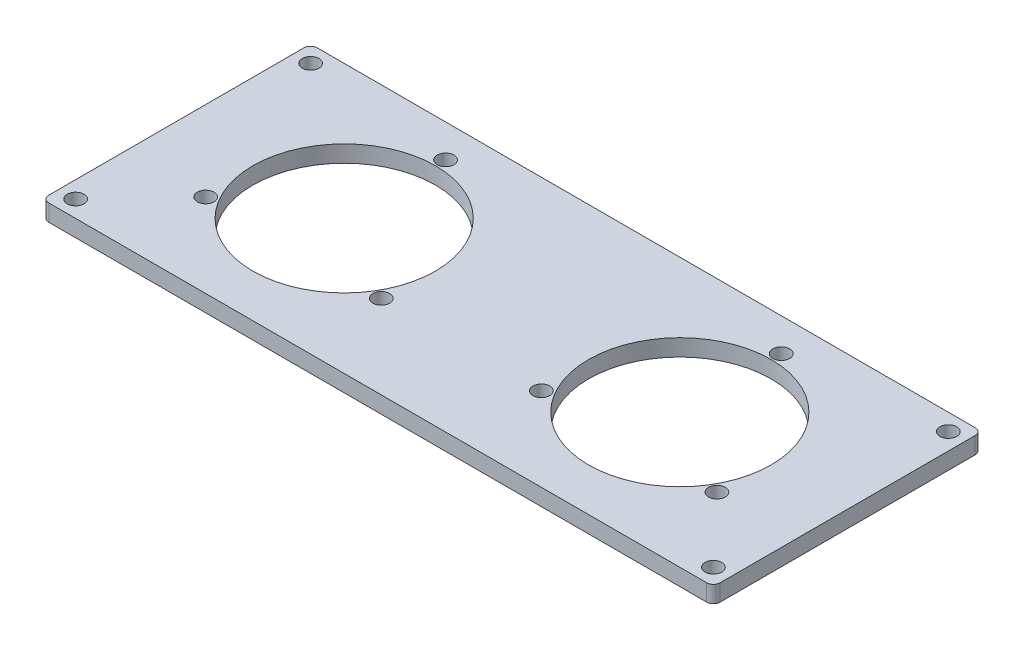
ISO-10303-21;
HEADER;
FILE_DESCRIPTION(('STEP AP214'),'2;1');
FILE_NAME('part.step','',(''),(''),'','','');
FILE_SCHEMA(('AUTOMOTIVE_DESIGN { 1 0 10303 214 1 1 1 1 }'));
ENDSEC;
DATA;
#1=APPLICATION_CONTEXT('core data for automotive mechanical design processes');
#2=APPLICATION_PROTOCOL_DEFINITION('international standard','automotive_design',2000,#1);
#3=PRODUCT_CONTEXT('',#1,'mechanical');
#4=PRODUCT('Part','Part','',(#3));
#5=PRODUCT_RELATED_PRODUCT_CATEGORY('part','',(#4));
#6=PRODUCT_DEFINITION_FORMATION('','',#4);
#7=PRODUCT_DEFINITION_CONTEXT('part definition',#1,'design');
#8=PRODUCT_DEFINITION('design','',#6,#7);
#9=PRODUCT_DEFINITION_SHAPE('','',#8);
#10=(LENGTH_UNIT() NAMED_UNIT(*) SI_UNIT(.MILLI.,.METRE.));
#11=(NAMED_UNIT(*) PLANE_ANGLE_UNIT() SI_UNIT($,.RADIAN.));
#12=(NAMED_UNIT(*) SI_UNIT($,.STERADIAN.) SOLID_ANGLE_UNIT());
#13=UNCERTAINTY_MEASURE_WITH_UNIT(LENGTH_MEASURE(1.E-05),#10,'distance_accuracy_value','');
#14=(GEOMETRIC_REPRESENTATION_CONTEXT(3) GLOBAL_UNCERTAINTY_ASSIGNED_CONTEXT((#13)) GLOBAL_UNIT_ASSIGNED_CONTEXT((#10,
#11,#12)) REPRESENTATION_CONTEXT('',''));
#15=CARTESIAN_POINT('',(0.,0.,0.));
#16=DIRECTION('',(0.,0.,1.));
#17=DIRECTION('',(1.,0.,0.));
#18=AXIS2_PLACEMENT_3D('',#15,#16,#17);
#19=CARTESIAN_POINT('',(0.,6.35,0.));
#20=DIRECTION('',(0.,-1.,0.));
#21=DIRECTION('',(0.,0.,-1.));
#22=AXIS2_PLACEMENT_3D('',#19,#20,#21);
#23=PLANE('',#22);
#24=DIRECTION('',(1.,0.,0.));
#25=VECTOR('',#24,1.);
#26=CARTESIAN_POINT('',(0.,6.35,0.));
#27=LINE('',#26,#25);
#28=CARTESIAN_POINT('',(2.54,6.35,0.));
#29=VERTEX_POINT('',#28);
#30=CARTESIAN_POINT('',(251.46,6.35,0.));
#31=VERTEX_POINT('',#30);
#32=EDGE_CURVE('E130',#29,#31,#27,.T.);
#33=ORIENTED_EDGE('',*,*,#32,.T.);
#34=CARTESIAN_POINT('',(251.46,6.35,-2.54));
#35=DIRECTION('',(0.,-1.,0.));
#36=DIRECTION('',(0.,0.,-1.));
#37=AXIS2_PLACEMENT_3D('',#34,#35,#36);
#38=CIRCLE('',#37,2.54);
#39=CARTESIAN_POINT('',(254.,6.35,-2.54));
#40=VERTEX_POINT('',#39);
#41=EDGE_CURVE('E54',#31,#40,#38,.F.);
#42=ORIENTED_EDGE('',*,*,#41,.T.);
#43=DIRECTION('',(0.,0.,1.));
#44=VECTOR('',#43,1.);
#45=CARTESIAN_POINT('',(254.,6.35,0.));
#46=LINE('',#45,#44);
#47=CARTESIAN_POINT('',(254.,6.35,-99.06));
#48=VERTEX_POINT('',#47);
#49=EDGE_CURVE('E187',#48,#40,#46,.T.);
#50=ORIENTED_EDGE('',*,*,#49,.F.);
#51=CARTESIAN_POINT('',(251.46,6.35,-99.06));
#52=DIRECTION('',(0.,-1.,0.));
#53=DIRECTION('',(0.,0.,-1.));
#54=AXIS2_PLACEMENT_3D('',#51,#52,#53);
#55=CIRCLE('',#54,2.54);
#56=CARTESIAN_POINT('',(251.46,6.35,-101.6));
#57=VERTEX_POINT('',#56);
#58=EDGE_CURVE('E61',#48,#57,#55,.F.);
#59=ORIENTED_EDGE('',*,*,#58,.T.);
#60=DIRECTION('',(-1.,0.,0.));
#61=VECTOR('',#60,1.);
#62=CARTESIAN_POINT('',(0.,6.35,-101.6));
#63=LINE('',#62,#61);
#64=CARTESIAN_POINT('',(2.54,6.35,-101.6));
#65=VERTEX_POINT('',#64);
#66=EDGE_CURVE('E132',#57,#65,#63,.T.);
#67=ORIENTED_EDGE('',*,*,#66,.T.);
#68=CARTESIAN_POINT('',(2.54,6.35,-99.06));
#69=DIRECTION('',(0.,-1.,0.));
#70=DIRECTION('',(0.,0.,-1.));
#71=AXIS2_PLACEMENT_3D('',#68,#69,#70);
#72=CIRCLE('',#71,2.54);
#73=CARTESIAN_POINT('',(0.,6.35,-99.06));
#74=VERTEX_POINT('',#73);
#75=EDGE_CURVE('E158',#65,#74,#72,.F.);
#76=ORIENTED_EDGE('',*,*,#75,.T.);
#77=DIRECTION('',(0.,0.,1.));
#78=VECTOR('',#77,1.);
#79=CARTESIAN_POINT('',(0.,6.35,0.));
#80=LINE('',#79,#78);
#81=CARTESIAN_POINT('',(0.,6.35,-2.54));
#82=VERTEX_POINT('',#81);
#83=EDGE_CURVE('E144',#74,#82,#80,.T.);
#84=ORIENTED_EDGE('',*,*,#83,.T.);
#85=CARTESIAN_POINT('',(2.54,6.35,-2.54));
#86=DIRECTION('',(0.,-1.,0.));
#87=DIRECTION('',(0.,0.,-1.));
#88=AXIS2_PLACEMENT_3D('',#85,#86,#87);
#89=CIRCLE('',#88,2.54);
#90=EDGE_CURVE('E161',#82,#29,#89,.F.);
#91=ORIENTED_EDGE('',*,*,#90,.T.);
#92=EDGE_LOOP('',(#33,#42,#50,#59,#67,#76,#84,#91));
#93=FACE_BOUND('',#92,.T.);
#94=CARTESIAN_POINT('',(63.5,6.35,-50.8));
#95=DIRECTION('',(0.,1.,0.));
#96=DIRECTION('',(0.,0.,1.));
#97=AXIS2_PLACEMENT_3D('',#94,#95,#96);
#98=CIRCLE('',#97,34.544);
#99=CARTESIAN_POINT('',(63.5,6.35,-16.256));
#100=VERTEX_POINT('',#99);
#101=EDGE_CURVE('E146',#100,#100,#98,.T.);
#102=ORIENTED_EDGE('',*,*,#101,.F.);
#103=EDGE_LOOP('',(#102));
#104=FACE_BOUND('',#103,.T.);
#105=CARTESIAN_POINT('',(63.5,6.35,-89.154));
#106=DIRECTION('',(0.,1.,0.));
#107=DIRECTION('',(0.,0.,1.));
#108=AXIS2_PLACEMENT_3D('',#105,#106,#107);
#109=CIRCLE('',#108,3.175);
#110=CARTESIAN_POINT('',(63.5,6.35,-85.979));
#111=VERTEX_POINT('',#110);
#112=EDGE_CURVE('E256',#111,#111,#109,.T.);
#113=ORIENTED_EDGE('',*,*,#112,.F.);
#114=EDGE_LOOP('',(#113));
#115=FACE_BOUND('',#114,.T.);
#116=CARTESIAN_POINT('',(6.35,6.35,-95.25));
#117=DIRECTION('',(0.,1.,0.));
#118=DIRECTION('',(0.,0.,1.));
#119=AXIS2_PLACEMENT_3D('',#116,#117,#118);
#120=CIRCLE('',#119,3.175);
#121=CARTESIAN_POINT('',(6.35,6.35,-92.075));
#122=VERTEX_POINT('',#121);
#123=EDGE_CURVE('E264',#122,#122,#120,.T.);
#124=ORIENTED_EDGE('',*,*,#123,.F.);
#125=EDGE_LOOP('',(#124));
#126=FACE_BOUND('',#125,.T.);
#127=CARTESIAN_POINT('',(6.35,6.35,-6.35));
#128=DIRECTION('',(0.,1.,0.));
#129=DIRECTION('',(0.,0.,1.));
#130=AXIS2_PLACEMENT_3D('',#127,#128,#129);
#131=CIRCLE('',#130,3.175);
#132=CARTESIAN_POINT('',(6.35,6.35,-3.175));
#133=VERTEX_POINT('',#132);
#134=EDGE_CURVE('E272',#133,#133,#131,.T.);
#135=ORIENTED_EDGE('',*,*,#134,.F.);
#136=EDGE_LOOP('',(#135));
#137=FACE_BOUND('',#136,.T.);
#138=CARTESIAN_POINT('',(96.7155383367484,6.35,-31.623));
#139=DIRECTION('',(0.,1.,0.));
#140=DIRECTION('',(0.,0.,1.));
#141=AXIS2_PLACEMENT_3D('',#138,#139,#140);
#142=CIRCLE('',#141,3.1749999999989);
#143=CARTESIAN_POINT('',(96.7155383367484,6.35,-28.4480000000011));
#144=VERTEX_POINT('',#143);
#145=EDGE_CURVE('E280',#144,#144,#142,.T.);
#146=ORIENTED_EDGE('',*,*,#145,.F.);
#147=EDGE_LOOP('',(#146));
#148=FACE_BOUND('',#147,.T.);
#149=CARTESIAN_POINT('',(30.2844616632516,6.35,-31.623));
#150=DIRECTION('',(0.,1.,0.));
#151=DIRECTION('',(0.,0.,1.));
#152=AXIS2_PLACEMENT_3D('',#149,#150,#151);
#153=CIRCLE('',#152,3.1749999999985);
#154=CARTESIAN_POINT('',(30.2844616632516,6.35,-28.4480000000015));
#155=VERTEX_POINT('',#154);
#156=EDGE_CURVE('E288',#155,#155,#153,.T.);
#157=ORIENTED_EDGE('',*,*,#156,.F.);
#158=EDGE_LOOP('',(#157));
#159=FACE_BOUND('',#158,.T.);
#160=CARTESIAN_POINT('',(223.715538336748,6.35,-31.623));
#161=DIRECTION('',(0.,-1.,0.));
#162=DIRECTION('',(0.,0.,1.));
#163=AXIS2_PLACEMENT_3D('',#160,#161,#162);
#164=CIRCLE('',#163,3.1749999999985);
#165=CARTESIAN_POINT('',(223.715538336748,6.35,-28.4480000000015));
#166=VERTEX_POINT('',#165);
#167=EDGE_CURVE('E337',#166,#166,#164,.T.);
#168=ORIENTED_EDGE('',*,*,#167,.T.);
#169=EDGE_LOOP('',(#168));
#170=FACE_BOUND('',#169,.T.);
#171=CARTESIAN_POINT('',(157.284461663252,6.35,-31.623));
#172=DIRECTION('',(0.,-1.,0.));
#173=DIRECTION('',(0.,0.,1.));
#174=AXIS2_PLACEMENT_3D('',#171,#172,#173);
#175=CIRCLE('',#174,3.1749999999989);
#176=CARTESIAN_POINT('',(157.284461663252,6.35,-28.4480000000011));
#177=VERTEX_POINT('',#176);
#178=EDGE_CURVE('E329',#177,#177,#175,.T.);
#179=ORIENTED_EDGE('',*,*,#178,.T.);
#180=EDGE_LOOP('',(#179));
#181=FACE_BOUND('',#180,.T.);
#182=CARTESIAN_POINT('',(247.65,6.35,-6.35));
#183=DIRECTION('',(0.,-1.,0.));
#184=DIRECTION('',(0.,0.,1.));
#185=AXIS2_PLACEMENT_3D('',#182,#183,#184);
#186=CIRCLE('',#185,3.175);
#187=CARTESIAN_POINT('',(247.65,6.35,-3.175));
#188=VERTEX_POINT('',#187);
#189=EDGE_CURVE('E321',#188,#188,#186,.T.);
#190=ORIENTED_EDGE('',*,*,#189,.T.);
#191=EDGE_LOOP('',(#190));
#192=FACE_BOUND('',#191,.T.);
#193=CARTESIAN_POINT('',(247.65,6.35,-95.25));
#194=DIRECTION('',(0.,-1.,0.));
#195=DIRECTION('',(0.,0.,1.));
#196=AXIS2_PLACEMENT_3D('',#193,#194,#195);
#197=CIRCLE('',#196,3.175);
#198=CARTESIAN_POINT('',(247.65,6.35,-92.075));
#199=VERTEX_POINT('',#198);
#200=EDGE_CURVE('E313',#199,#199,#197,.T.);
#201=ORIENTED_EDGE('',*,*,#200,.T.);
#202=EDGE_LOOP('',(#201));
#203=FACE_BOUND('',#202,.T.);
#204=CARTESIAN_POINT('',(190.5,6.35,-89.154));
#205=DIRECTION('',(0.,-1.,0.));
#206=DIRECTION('',(0.,0.,1.));
#207=AXIS2_PLACEMENT_3D('',#204,#205,#206);
#208=CIRCLE('',#207,3.175);
#209=CARTESIAN_POINT('',(190.5,6.35,-85.979));
#210=VERTEX_POINT('',#209);
#211=EDGE_CURVE('E305',#210,#210,#208,.T.);
#212=ORIENTED_EDGE('',*,*,#211,.T.);
#213=EDGE_LOOP('',(#212));
#214=FACE_BOUND('',#213,.T.);
#215=CARTESIAN_POINT('',(190.5,6.35,-50.8));
#216=DIRECTION('',(0.,-1.,0.));
#217=DIRECTION('',(0.,0.,1.));
#218=AXIS2_PLACEMENT_3D('',#215,#216,#217);
#219=CIRCLE('',#218,34.544);
#220=CARTESIAN_POINT('',(190.5,6.35,-16.256));
#221=VERTEX_POINT('',#220);
#222=EDGE_CURVE('E299',#221,#221,#219,.T.);
#223=ORIENTED_EDGE('',*,*,#222,.T.);
#224=EDGE_LOOP('',(#223));
#225=FACE_BOUND('',#224,.T.);
#226=ADVANCED_FACE('F45',(#93,#104,#115,#126,#137,#148,#159,#170,#181,#192,#203,#214,#225),#23,.F.);
#227=CARTESIAN_POINT('',(0.,0.,0.));
#228=DIRECTION('',(0.,-1.,0.));
#229=DIRECTION('',(0.,0.,-1.));
#230=AXIS2_PLACEMENT_3D('',#227,#228,#229);
#231=PLANE('',#230);
#232=CARTESIAN_POINT('',(96.7155383367484,0.,-31.623));
#233=DIRECTION('',(0.,1.,0.));
#234=DIRECTION('',(0.,0.,1.));
#235=AXIS2_PLACEMENT_3D('',#232,#233,#234);
#236=CIRCLE('',#235,3.1749999999989);
#237=CARTESIAN_POINT('',(96.7155383367484,0.,-28.4480000000011));
#238=VERTEX_POINT('',#237);
#239=EDGE_CURVE('E284',#238,#238,#236,.T.);
#240=ORIENTED_EDGE('',*,*,#239,.T.);
#241=EDGE_LOOP('',(#240));
#242=FACE_BOUND('',#241,.T.);
#243=CARTESIAN_POINT('',(6.35,0.,-95.25));
#244=DIRECTION('',(0.,1.,0.));
#245=DIRECTION('',(0.,0.,1.));
#246=AXIS2_PLACEMENT_3D('',#243,#244,#245);
#247=CIRCLE('',#246,3.175);
#248=CARTESIAN_POINT('',(6.35,0.,-92.075));
#249=VERTEX_POINT('',#248);
#250=EDGE_CURVE('E268',#249,#249,#247,.T.);
#251=ORIENTED_EDGE('',*,*,#250,.T.);
#252=EDGE_LOOP('',(#251));
#253=FACE_BOUND('',#252,.T.);
#254=CARTESIAN_POINT('',(63.5,0.,-50.8));
#255=DIRECTION('',(0.,1.,0.));
#256=DIRECTION('',(0.,0.,1.));
#257=AXIS2_PLACEMENT_3D('',#254,#255,#256);
#258=CIRCLE('',#257,34.544);
#259=CARTESIAN_POINT('',(63.5,0.,-16.256));
#260=VERTEX_POINT('',#259);
#261=EDGE_CURVE('E251',#260,#260,#258,.T.);
#262=ORIENTED_EDGE('',*,*,#261,.T.);
#263=EDGE_LOOP('',(#262));
#264=FACE_BOUND('',#263,.T.);
#265=DIRECTION('',(0.,0.,1.));
#266=VECTOR('',#265,1.);
#267=CARTESIAN_POINT('',(254.,0.,0.));
#268=LINE('',#267,#266);
#269=CARTESIAN_POINT('',(254.,0.,-99.06));
#270=VERTEX_POINT('',#269);
#271=CARTESIAN_POINT('',(254.,0.,-2.54));
#272=VERTEX_POINT('',#271);
#273=EDGE_CURVE('E196',#270,#272,#268,.T.);
#274=ORIENTED_EDGE('',*,*,#273,.T.);
#275=CARTESIAN_POINT('',(251.46,0.,-2.54));
#276=DIRECTION('',(0.,-1.,0.));
#277=DIRECTION('',(0.,0.,-1.));
#278=AXIS2_PLACEMENT_3D('',#275,#276,#277);
#279=CIRCLE('',#278,2.54);
#280=CARTESIAN_POINT('',(251.46,0.,0.));
#281=VERTEX_POINT('',#280);
#282=EDGE_CURVE('E137',#272,#281,#279,.T.);
#283=ORIENTED_EDGE('',*,*,#282,.T.);
#284=DIRECTION('',(1.,0.,0.));
#285=VECTOR('',#284,1.);
#286=CARTESIAN_POINT('',(0.,0.,0.));
#287=LINE('',#286,#285);
#288=CARTESIAN_POINT('',(2.54,0.,0.));
#289=VERTEX_POINT('',#288);
#290=EDGE_CURVE('E129',#289,#281,#287,.T.);
#291=ORIENTED_EDGE('',*,*,#290,.F.);
#292=CARTESIAN_POINT('',(2.54,0.,-2.54));
#293=DIRECTION('',(0.,-1.,0.));
#294=DIRECTION('',(0.,0.,-1.));
#295=AXIS2_PLACEMENT_3D('',#292,#293,#294);
#296=CIRCLE('',#295,2.54);
#297=CARTESIAN_POINT('',(0.,0.,-2.54));
#298=VERTEX_POINT('',#297);
#299=EDGE_CURVE('E114',#289,#298,#296,.T.);
#300=ORIENTED_EDGE('',*,*,#299,.T.);
#301=DIRECTION('',(0.,0.,1.));
#302=VECTOR('',#301,1.);
#303=CARTESIAN_POINT('',(0.,0.,0.));
#304=LINE('',#303,#302);
#305=CARTESIAN_POINT('',(0.,0.,-99.06));
#306=VERTEX_POINT('',#305);
#307=EDGE_CURVE('E140',#306,#298,#304,.T.);
#308=ORIENTED_EDGE('',*,*,#307,.F.);
#309=CARTESIAN_POINT('',(2.54,0.,-99.06));
#310=DIRECTION('',(0.,-1.,0.));
#311=DIRECTION('',(0.,0.,-1.));
#312=AXIS2_PLACEMENT_3D('',#309,#310,#311);
#313=CIRCLE('',#312,2.54);
#314=CARTESIAN_POINT('',(2.54,0.,-101.6));
#315=VERTEX_POINT('',#314);
#316=EDGE_CURVE('E126',#306,#315,#313,.T.);
#317=ORIENTED_EDGE('',*,*,#316,.T.);
#318=DIRECTION('',(-1.,0.,0.));
#319=VECTOR('',#318,1.);
#320=CARTESIAN_POINT('',(0.,0.,-101.6));
#321=LINE('',#320,#319);
#322=CARTESIAN_POINT('',(251.46,0.,-101.6));
#323=VERTEX_POINT('',#322);
#324=EDGE_CURVE('E139',#323,#315,#321,.T.);
#325=ORIENTED_EDGE('',*,*,#324,.F.);
#326=CARTESIAN_POINT('',(251.46,0.,-99.06));
#327=DIRECTION('',(0.,-1.,0.));
#328=DIRECTION('',(0.,0.,-1.));
#329=AXIS2_PLACEMENT_3D('',#326,#327,#328);
#330=CIRCLE('',#329,2.54);
#331=EDGE_CURVE('E175',#323,#270,#330,.T.);
#332=ORIENTED_EDGE('',*,*,#331,.T.);
#333=EDGE_LOOP('',(#274,#283,#291,#300,#308,#317,#325,#332));
#334=FACE_BOUND('',#333,.T.);
#335=CARTESIAN_POINT('',(63.5,0.,-89.154));
#336=DIRECTION('',(0.,1.,0.));
#337=DIRECTION('',(0.,0.,1.));
#338=AXIS2_PLACEMENT_3D('',#335,#336,#337);
#339=CIRCLE('',#338,3.175);
#340=CARTESIAN_POINT('',(63.5,0.,-85.979));
#341=VERTEX_POINT('',#340);
#342=EDGE_CURVE('E260',#341,#341,#339,.T.);
#343=ORIENTED_EDGE('',*,*,#342,.T.);
#344=EDGE_LOOP('',(#343));
#345=FACE_BOUND('',#344,.T.);
#346=CARTESIAN_POINT('',(6.35,0.,-6.35));
#347=DIRECTION('',(0.,1.,0.));
#348=DIRECTION('',(0.,0.,1.));
#349=AXIS2_PLACEMENT_3D('',#346,#347,#348);
#350=CIRCLE('',#349,3.175);
#351=CARTESIAN_POINT('',(6.35,0.,-3.175));
#352=VERTEX_POINT('',#351);
#353=EDGE_CURVE('E276',#352,#352,#350,.T.);
#354=ORIENTED_EDGE('',*,*,#353,.T.);
#355=EDGE_LOOP('',(#354));
#356=FACE_BOUND('',#355,.T.);
#357=CARTESIAN_POINT('',(30.2844616632516,0.,-31.623));
#358=DIRECTION('',(0.,1.,0.));
#359=DIRECTION('',(0.,0.,1.));
#360=AXIS2_PLACEMENT_3D('',#357,#358,#359);
#361=CIRCLE('',#360,3.1749999999985);
#362=CARTESIAN_POINT('',(30.2844616632516,0.,-28.4480000000015));
#363=VERTEX_POINT('',#362);
#364=EDGE_CURVE('E195',#363,#363,#361,.T.);
#365=ORIENTED_EDGE('',*,*,#364,.T.);
#366=EDGE_LOOP('',(#365));
#367=FACE_BOUND('',#366,.T.);
#368=CARTESIAN_POINT('',(223.715538336748,0.,-31.623));
#369=DIRECTION('',(0.,-1.,0.));
#370=DIRECTION('',(0.,0.,1.));
#371=AXIS2_PLACEMENT_3D('',#368,#369,#370);
#372=CIRCLE('',#371,3.1749999999985);
#373=CARTESIAN_POINT('',(223.715538336748,0.,-28.4480000000015));
#374=VERTEX_POINT('',#373);
#375=EDGE_CURVE('E341',#374,#374,#372,.T.);
#376=ORIENTED_EDGE('',*,*,#375,.F.);
#377=EDGE_LOOP('',(#376));
#378=FACE_BOUND('',#377,.T.);
#379=CARTESIAN_POINT('',(157.284461663252,0.,-31.623));
#380=DIRECTION('',(0.,-1.,0.));
#381=DIRECTION('',(0.,0.,1.));
#382=AXIS2_PLACEMENT_3D('',#379,#380,#381);
#383=CIRCLE('',#382,3.1749999999989);
#384=CARTESIAN_POINT('',(157.284461663252,0.,-28.4480000000011));
#385=VERTEX_POINT('',#384);
#386=EDGE_CURVE('E333',#385,#385,#383,.T.);
#387=ORIENTED_EDGE('',*,*,#386,.F.);
#388=EDGE_LOOP('',(#387));
#389=FACE_BOUND('',#388,.T.);
#390=CARTESIAN_POINT('',(247.65,0.,-6.35));
#391=DIRECTION('',(0.,-1.,0.));
#392=DIRECTION('',(0.,0.,1.));
#393=AXIS2_PLACEMENT_3D('',#390,#391,#392);
#394=CIRCLE('',#393,3.175);
#395=CARTESIAN_POINT('',(247.65,0.,-3.175));
#396=VERTEX_POINT('',#395);
#397=EDGE_CURVE('E325',#396,#396,#394,.T.);
#398=ORIENTED_EDGE('',*,*,#397,.F.);
#399=EDGE_LOOP('',(#398));
#400=FACE_BOUND('',#399,.T.);
#401=CARTESIAN_POINT('',(247.65,0.,-95.25));
#402=DIRECTION('',(0.,-1.,0.));
#403=DIRECTION('',(0.,0.,1.));
#404=AXIS2_PLACEMENT_3D('',#401,#402,#403);
#405=CIRCLE('',#404,3.175);
#406=CARTESIAN_POINT('',(247.65,0.,-92.075));
#407=VERTEX_POINT('',#406);
#408=EDGE_CURVE('E317',#407,#407,#405,.T.);
#409=ORIENTED_EDGE('',*,*,#408,.F.);
#410=EDGE_LOOP('',(#409));
#411=FACE_BOUND('',#410,.T.);
#412=CARTESIAN_POINT('',(190.5,0.,-89.154));
#413=DIRECTION('',(0.,-1.,0.));
#414=DIRECTION('',(0.,0.,1.));
#415=AXIS2_PLACEMENT_3D('',#412,#413,#414);
#416=CIRCLE('',#415,3.175);
#417=CARTESIAN_POINT('',(190.5,0.,-85.979));
#418=VERTEX_POINT('',#417);
#419=EDGE_CURVE('E309',#418,#418,#416,.T.);
#420=ORIENTED_EDGE('',*,*,#419,.F.);
#421=EDGE_LOOP('',(#420));
#422=FACE_BOUND('',#421,.T.);
#423=CARTESIAN_POINT('',(190.5,0.,-50.8));
#424=DIRECTION('',(0.,-1.,0.));
#425=DIRECTION('',(0.,0.,1.));
#426=AXIS2_PLACEMENT_3D('',#423,#424,#425);
#427=CIRCLE('',#426,34.544);
#428=CARTESIAN_POINT('',(190.5,0.,-16.256));
#429=VERTEX_POINT('',#428);
#430=EDGE_CURVE('E301',#429,#429,#427,.T.);
#431=ORIENTED_EDGE('',*,*,#430,.F.);
#432=EDGE_LOOP('',(#431));
#433=FACE_BOUND('',#432,.T.);
#434=ADVANCED_FACE('F135',(#242,#253,#264,#334,#345,#356,#367,#378,#389,#400,#411,#422,#433),
#231,.T.);
#435=CARTESIAN_POINT('',(0.,6.35,0.));
#436=DIRECTION('',(1.,0.,0.));
#437=DIRECTION('',(0.,0.,-1.));
#438=AXIS2_PLACEMENT_3D('',#435,#436,#437);
#439=PLANE('',#438);
#440=ORIENTED_EDGE('',*,*,#307,.T.);
#441=DIRECTION('',(0.,-1.,0.));
#442=VECTOR('',#441,1.);
#443=CARTESIAN_POINT('',(0.,6.35,-2.54));
#444=LINE('',#443,#442);
#445=EDGE_CURVE('E119',#298,#82,#444,.F.);
#446=ORIENTED_EDGE('',*,*,#445,.T.);
#447=ORIENTED_EDGE('',*,*,#83,.F.);
#448=DIRECTION('',(0.,-1.,0.));
#449=VECTOR('',#448,1.);
#450=CARTESIAN_POINT('',(0.,6.35,-99.06));
#451=LINE('',#450,#449);
#452=EDGE_CURVE('E125',#74,#306,#451,.T.);
#453=ORIENTED_EDGE('',*,*,#452,.T.);
#454=EDGE_LOOP('',(#440,#446,#447,#453));
#455=FACE_BOUND('',#454,.T.);
#456=ADVANCED_FACE('F216',(#455),#439,.F.);
#457=CARTESIAN_POINT('',(0.,6.35,0.));
#458=DIRECTION('',(0.,0.,-1.));
#459=DIRECTION('',(-1.,0.,0.));
#460=AXIS2_PLACEMENT_3D('',#457,#458,#459);
#461=PLANE('',#460);
#462=ORIENTED_EDGE('',*,*,#290,.T.);
#463=DIRECTION('',(0.,-1.,0.));
#464=VECTOR('',#463,1.);
#465=CARTESIAN_POINT('',(251.46,6.35,0.));
#466=LINE('',#465,#464);
#467=EDGE_CURVE('E69',#281,#31,#466,.F.);
#468=ORIENTED_EDGE('',*,*,#467,.T.);
#469=ORIENTED_EDGE('',*,*,#32,.F.);
#470=DIRECTION('',(0.,-1.,0.));
#471=VECTOR('',#470,1.);
#472=CARTESIAN_POINT('',(2.54,6.35,0.));
#473=LINE('',#472,#471);
#474=EDGE_CURVE('E118',#29,#289,#473,.T.);
#475=ORIENTED_EDGE('',*,*,#474,.T.);
#476=EDGE_LOOP('',(#462,#468,#469,#475));
#477=FACE_BOUND('',#476,.T.);
#478=ADVANCED_FACE('F128',(#477),#461,.F.);
#479=CARTESIAN_POINT('',(0.,6.35,-101.6));
#480=DIRECTION('',(0.,0.,1.));
#481=DIRECTION('',(1.,0.,0.));
#482=AXIS2_PLACEMENT_3D('',#479,#480,#481);
#483=PLANE('',#482);
#484=ORIENTED_EDGE('',*,*,#66,.F.);
#485=DIRECTION('',(0.,-1.,0.));
#486=VECTOR('',#485,1.);
#487=CARTESIAN_POINT('',(251.46,0.,-101.6));
#488=LINE('',#487,#486);
#489=EDGE_CURVE('E11',#57,#323,#488,.T.);
#490=ORIENTED_EDGE('',*,*,#489,.T.);
#491=ORIENTED_EDGE('',*,*,#324,.T.);
#492=DIRECTION('',(0.,-1.,0.));
#493=VECTOR('',#492,1.);
#494=CARTESIAN_POINT('',(2.54,6.35,-101.6));
#495=LINE('',#494,#493);
#496=EDGE_CURVE('E164',#315,#65,#495,.F.);
#497=ORIENTED_EDGE('',*,*,#496,.T.);
#498=EDGE_LOOP('',(#484,#490,#491,#497));
#499=FACE_BOUND('',#498,.T.);
#500=ADVANCED_FACE('F223',(#499),#483,.F.);
#501=CARTESIAN_POINT('',(63.5,6.35,-50.8));
#502=DIRECTION('',(0.,-1.,0.));
#503=DIRECTION('',(0.,0.,-1.));
#504=AXIS2_PLACEMENT_3D('',#501,#502,#503);
#505=CYLINDRICAL_SURFACE('',#504,34.544);
#506=ORIENTED_EDGE('',*,*,#101,.T.);
#507=EDGE_LOOP('',(#506));
#508=FACE_BOUND('',#507,.T.);
#509=ORIENTED_EDGE('',*,*,#261,.F.);
#510=EDGE_LOOP('',(#509));
#511=FACE_BOUND('',#510,.T.);
#512=ADVANCED_FACE('F220',(#508,#511),#505,.F.);
#513=CARTESIAN_POINT('',(63.5,6.35,-89.154));
#514=DIRECTION('',(0.,-1.,0.));
#515=DIRECTION('',(0.,0.,-1.));
#516=AXIS2_PLACEMENT_3D('',#513,#514,#515);
#517=CYLINDRICAL_SURFACE('',#516,3.175);
#518=ORIENTED_EDGE('',*,*,#112,.T.);
#519=EDGE_LOOP('',(#518));
#520=FACE_BOUND('',#519,.T.);
#521=ORIENTED_EDGE('',*,*,#342,.F.);
#522=EDGE_LOOP('',(#521));
#523=FACE_BOUND('',#522,.T.);
#524=ADVANCED_FACE('F390',(#520,#523),#517,.F.);
#525=CARTESIAN_POINT('',(6.35,6.35,-95.25));
#526=DIRECTION('',(0.,-1.,0.));
#527=DIRECTION('',(0.,0.,-1.));
#528=AXIS2_PLACEMENT_3D('',#525,#526,#527);
#529=CYLINDRICAL_SURFACE('',#528,3.175);
#530=ORIENTED_EDGE('',*,*,#123,.T.);
#531=EDGE_LOOP('',(#530));
#532=FACE_BOUND('',#531,.T.);
#533=ORIENTED_EDGE('',*,*,#250,.F.);
#534=EDGE_LOOP('',(#533));
#535=FACE_BOUND('',#534,.T.);
#536=ADVANCED_FACE('F387',(#532,#535),#529,.F.);
#537=CARTESIAN_POINT('',(6.35,6.35,-6.35));
#538=DIRECTION('',(0.,-1.,0.));
#539=DIRECTION('',(0.,0.,-1.));
#540=AXIS2_PLACEMENT_3D('',#537,#538,#539);
#541=CYLINDRICAL_SURFACE('',#540,3.175);
#542=ORIENTED_EDGE('',*,*,#134,.T.);
#543=EDGE_LOOP('',(#542));
#544=FACE_BOUND('',#543,.T.);
#545=ORIENTED_EDGE('',*,*,#353,.F.);
#546=EDGE_LOOP('',(#545));
#547=FACE_BOUND('',#546,.T.);
#548=ADVANCED_FACE('F383',(#544,#547),#541,.F.);
#549=CARTESIAN_POINT('',(96.7155383367484,6.35,-31.623));
#550=DIRECTION('',(0.,-1.,0.));
#551=DIRECTION('',(0.,0.,-1.));
#552=AXIS2_PLACEMENT_3D('',#549,#550,#551);
#553=CYLINDRICAL_SURFACE('',#552,3.1749999999989);
#554=ORIENTED_EDGE('',*,*,#145,.T.);
#555=EDGE_LOOP('',(#554));
#556=FACE_BOUND('',#555,.T.);
#557=ORIENTED_EDGE('',*,*,#239,.F.);
#558=EDGE_LOOP('',(#557));
#559=FACE_BOUND('',#558,.T.);
#560=ADVANCED_FACE('F379',(#556,#559),#553,.F.);
#561=CARTESIAN_POINT('',(30.2844616632516,6.35,-31.623));
#562=DIRECTION('',(0.,-1.,0.));
#563=DIRECTION('',(0.,0.,-1.));
#564=AXIS2_PLACEMENT_3D('',#561,#562,#563);
#565=CYLINDRICAL_SURFACE('',#564,3.1749999999985);
#566=ORIENTED_EDGE('',*,*,#156,.T.);
#567=EDGE_LOOP('',(#566));
#568=FACE_BOUND('',#567,.T.);
#569=ORIENTED_EDGE('',*,*,#364,.F.);
#570=EDGE_LOOP('',(#569));
#571=FACE_BOUND('',#570,.T.);
#572=ADVANCED_FACE('F234',(#568,#571),#565,.F.);
#573=CARTESIAN_POINT('',(2.54,6.35,-2.54));
#574=DIRECTION('',(0.,-1.,0.));
#575=DIRECTION('',(0.,0.,-1.));
#576=AXIS2_PLACEMENT_3D('',#573,#574,#575);
#577=CYLINDRICAL_SURFACE('',#576,2.54);
#578=ORIENTED_EDGE('',*,*,#90,.F.);
#579=ORIENTED_EDGE('',*,*,#445,.F.);
#580=ORIENTED_EDGE('',*,*,#299,.F.);
#581=ORIENTED_EDGE('',*,*,#474,.F.);
#582=EDGE_LOOP('',(#578,#579,#580,#581));
#583=FACE_BOUND('',#582,.T.);
#584=ADVANCED_FACE('F117',(#583),#577,.T.);
#585=CARTESIAN_POINT('',(2.54,6.35,-99.06));
#586=DIRECTION('',(0.,-1.,0.));
#587=DIRECTION('',(0.,0.,-1.));
#588=AXIS2_PLACEMENT_3D('',#585,#586,#587);
#589=CYLINDRICAL_SURFACE('',#588,2.54);
#590=ORIENTED_EDGE('',*,*,#75,.F.);
#591=ORIENTED_EDGE('',*,*,#496,.F.);
#592=ORIENTED_EDGE('',*,*,#316,.F.);
#593=ORIENTED_EDGE('',*,*,#452,.F.);
#594=EDGE_LOOP('',(#590,#591,#592,#593));
#595=FACE_BOUND('',#594,.T.);
#596=ADVANCED_FACE('F233',(#595),#589,.T.);
#597=CARTESIAN_POINT('',(254.,6.35,0.));
#598=DIRECTION('',(1.,0.,0.));
#599=DIRECTION('',(0.,0.,-1.));
#600=AXIS2_PLACEMENT_3D('',#597,#598,#599);
#601=PLANE('',#600);
#602=ORIENTED_EDGE('',*,*,#49,.T.);
#603=DIRECTION('',(0.,-1.,0.));
#604=VECTOR('',#603,1.);
#605=CARTESIAN_POINT('',(254.,0.,-2.54));
#606=LINE('',#605,#604);
#607=EDGE_CURVE('E171',#40,#272,#606,.T.);
#608=ORIENTED_EDGE('',*,*,#607,.T.);
#609=ORIENTED_EDGE('',*,*,#273,.F.);
#610=DIRECTION('',(0.,-1.,0.));
#611=VECTOR('',#610,1.);
#612=CARTESIAN_POINT('',(254.,6.35,-99.06));
#613=LINE('',#612,#611);
#614=EDGE_CURVE('E168',#270,#48,#613,.F.);
#615=ORIENTED_EDGE('',*,*,#614,.T.);
#616=EDGE_LOOP('',(#602,#608,#609,#615));
#617=FACE_BOUND('',#616,.T.);
#618=ADVANCED_FACE('F191',(#617),#601,.T.);
#619=CARTESIAN_POINT('',(190.5,6.35,-50.8));
#620=DIRECTION('',(0.,-1.,0.));
#621=DIRECTION('',(0.,0.,-1.));
#622=AXIS2_PLACEMENT_3D('',#619,#620,#621);
#623=CYLINDRICAL_SURFACE('',#622,34.544);
#624=ORIENTED_EDGE('',*,*,#222,.F.);
#625=EDGE_LOOP('',(#624));
#626=FACE_BOUND('',#625,.T.);
#627=ORIENTED_EDGE('',*,*,#430,.T.);
#628=EDGE_LOOP('',(#627));
#629=FACE_BOUND('',#628,.T.);
#630=ADVANCED_FACE('F239',(#626,#629),#623,.F.);
#631=CARTESIAN_POINT('',(190.5,6.35,-89.154));
#632=DIRECTION('',(0.,-1.,0.));
#633=DIRECTION('',(0.,0.,-1.));
#634=AXIS2_PLACEMENT_3D('',#631,#632,#633);
#635=CYLINDRICAL_SURFACE('',#634,3.175);
#636=ORIENTED_EDGE('',*,*,#211,.F.);
#637=EDGE_LOOP('',(#636));
#638=FACE_BOUND('',#637,.T.);
#639=ORIENTED_EDGE('',*,*,#419,.T.);
#640=EDGE_LOOP('',(#639));
#641=FACE_BOUND('',#640,.T.);
#642=ADVANCED_FACE('F365',(#638,#641),#635,.F.);
#643=CARTESIAN_POINT('',(247.65,6.35,-95.25));
#644=DIRECTION('',(0.,-1.,0.));
#645=DIRECTION('',(0.,0.,-1.));
#646=AXIS2_PLACEMENT_3D('',#643,#644,#645);
#647=CYLINDRICAL_SURFACE('',#646,3.175);
#648=ORIENTED_EDGE('',*,*,#200,.F.);
#649=EDGE_LOOP('',(#648));
#650=FACE_BOUND('',#649,.T.);
#651=ORIENTED_EDGE('',*,*,#408,.T.);
#652=EDGE_LOOP('',(#651));
#653=FACE_BOUND('',#652,.T.);
#654=ADVANCED_FACE('F371',(#650,#653),#647,.F.);
#655=CARTESIAN_POINT('',(247.65,6.35,-6.35));
#656=DIRECTION('',(0.,-1.,0.));
#657=DIRECTION('',(0.,0.,-1.));
#658=AXIS2_PLACEMENT_3D('',#655,#656,#657);
#659=CYLINDRICAL_SURFACE('',#658,3.175);
#660=ORIENTED_EDGE('',*,*,#189,.F.);
#661=EDGE_LOOP('',(#660));
#662=FACE_BOUND('',#661,.T.);
#663=ORIENTED_EDGE('',*,*,#397,.T.);
#664=EDGE_LOOP('',(#663));
#665=FACE_BOUND('',#664,.T.);
#666=ADVANCED_FACE('F522',(#662,#665),#659,.F.);
#667=CARTESIAN_POINT('',(157.284461663252,6.35,-31.623));
#668=DIRECTION('',(0.,-1.,0.));
#669=DIRECTION('',(0.,0.,-1.));
#670=AXIS2_PLACEMENT_3D('',#667,#668,#669);
#671=CYLINDRICAL_SURFACE('',#670,3.1749999999989);
#672=ORIENTED_EDGE('',*,*,#178,.F.);
#673=EDGE_LOOP('',(#672));
#674=FACE_BOUND('',#673,.T.);
#675=ORIENTED_EDGE('',*,*,#386,.T.);
#676=EDGE_LOOP('',(#675));
#677=FACE_BOUND('',#676,.T.);
#678=ADVANCED_FACE('F206',(#674,#677),#671,.F.);
#679=CARTESIAN_POINT('',(223.715538336748,6.35,-31.623));
#680=DIRECTION('',(0.,-1.,0.));
#681=DIRECTION('',(0.,0.,-1.));
#682=AXIS2_PLACEMENT_3D('',#679,#680,#681);
#683=CYLINDRICAL_SURFACE('',#682,3.1749999999985);
#684=ORIENTED_EDGE('',*,*,#167,.F.);
#685=EDGE_LOOP('',(#684));
#686=FACE_BOUND('',#685,.T.);
#687=ORIENTED_EDGE('',*,*,#375,.T.);
#688=EDGE_LOOP('',(#687));
#689=FACE_BOUND('',#688,.T.);
#690=ADVANCED_FACE('F200',(#686,#689),#683,.F.);
#691=CARTESIAN_POINT('',(251.46,6.35,-2.54));
#692=DIRECTION('',(0.,1.,0.));
#693=DIRECTION('',(0.,0.,1.));
#694=AXIS2_PLACEMENT_3D('',#691,#692,#693);
#695=CYLINDRICAL_SURFACE('',#694,2.54);
#696=ORIENTED_EDGE('',*,*,#41,.F.);
#697=ORIENTED_EDGE('',*,*,#467,.F.);
#698=ORIENTED_EDGE('',*,*,#282,.F.);
#699=ORIENTED_EDGE('',*,*,#607,.F.);
#700=EDGE_LOOP('',(#696,#697,#698,#699));
#701=FACE_BOUND('',#700,.T.);
#702=ADVANCED_FACE('F198',(#701),#695,.T.);
#703=CARTESIAN_POINT('',(251.46,6.35,-99.06));
#704=DIRECTION('',(0.,1.,0.));
#705=DIRECTION('',(0.,0.,1.));
#706=AXIS2_PLACEMENT_3D('',#703,#704,#705);
#707=CYLINDRICAL_SURFACE('',#706,2.54);
#708=ORIENTED_EDGE('',*,*,#58,.F.);
#709=ORIENTED_EDGE('',*,*,#614,.F.);
#710=ORIENTED_EDGE('',*,*,#331,.F.);
#711=ORIENTED_EDGE('',*,*,#489,.F.);
#712=EDGE_LOOP('',(#708,#709,#710,#711));
#713=FACE_BOUND('',#712,.T.);
#714=ADVANCED_FACE('F47',(#713),#707,.T.);
#715=CLOSED_SHELL('',(#226,#434,#456,#478,#500,#512,#524,#536,#548,#560,#572,#584,#596,#618,
#630,#642,#654,#666,#678,#690,#702,#714));
#716=MANIFOLD_SOLID_BREP('B2',#715);
#717=ADVANCED_BREP_SHAPE_REPRESENTATION('',(#18,#716),#14);
#718=SHAPE_DEFINITION_REPRESENTATION(#9,#717);
ENDSEC;
END-ISO-10303-21;
